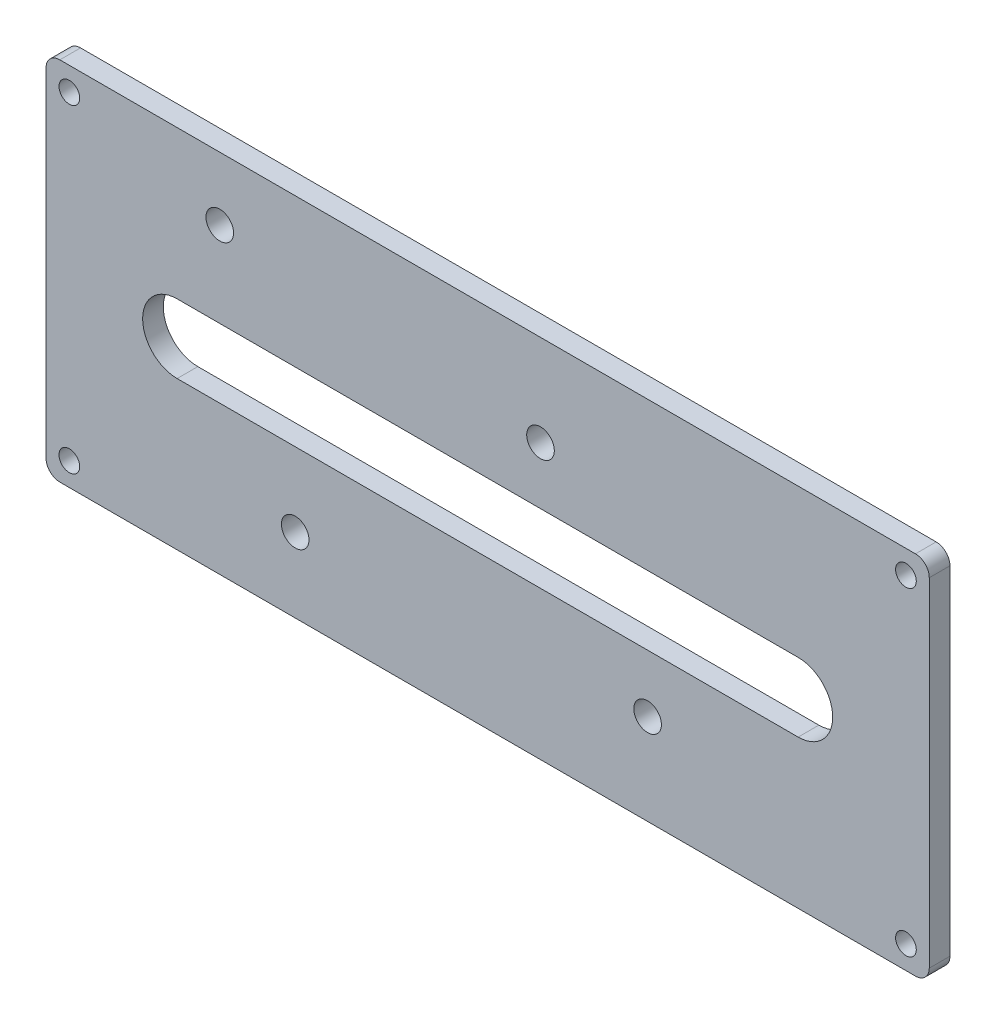
ISO-10303-21;
HEADER;
FILE_DESCRIPTION(('STEP AP214'),'2;1');
FILE_NAME('part.step','',(''),(''),'','','');
FILE_SCHEMA(('AUTOMOTIVE_DESIGN { 1 0 10303 214 1 1 1 1 }'));
ENDSEC;
DATA;
#1=APPLICATION_CONTEXT('core data for automotive mechanical design processes');
#2=APPLICATION_PROTOCOL_DEFINITION('international standard','automotive_design',2000,#1);
#3=PRODUCT_CONTEXT('',#1,'mechanical');
#4=PRODUCT('Part','Part','',(#3));
#5=PRODUCT_RELATED_PRODUCT_CATEGORY('part','',(#4));
#6=PRODUCT_DEFINITION_FORMATION('','',#4);
#7=PRODUCT_DEFINITION_CONTEXT('part definition',#1,'design');
#8=PRODUCT_DEFINITION('design','',#6,#7);
#9=PRODUCT_DEFINITION_SHAPE('','',#8);
#10=(LENGTH_UNIT() NAMED_UNIT(*) SI_UNIT(.MILLI.,.METRE.));
#11=(NAMED_UNIT(*) PLANE_ANGLE_UNIT() SI_UNIT($,.RADIAN.));
#12=(NAMED_UNIT(*) SI_UNIT($,.STERADIAN.) SOLID_ANGLE_UNIT());
#13=UNCERTAINTY_MEASURE_WITH_UNIT(LENGTH_MEASURE(1.E-05),#10,'distance_accuracy_value','');
#14=(GEOMETRIC_REPRESENTATION_CONTEXT(3) GLOBAL_UNCERTAINTY_ASSIGNED_CONTEXT((#13)) GLOBAL_UNIT_ASSIGNED_CONTEXT((#10,
#11,#12)) REPRESENTATION_CONTEXT('',''));
#15=CARTESIAN_POINT('',(0.,0.,0.));
#16=DIRECTION('',(0.,0.,1.));
#17=DIRECTION('',(1.,0.,0.));
#18=AXIS2_PLACEMENT_3D('',#15,#16,#17);
#19=CARTESIAN_POINT('',(-64.,26.5,3.));
#20=DIRECTION('',(1.,0.,0.));
#21=DIRECTION('',(0.,0.,-1.));
#22=AXIS2_PLACEMENT_3D('',#19,#20,#21);
#23=PLANE('',#22);
#24=DIRECTION('',(0.,-1.,0.));
#25=VECTOR('',#24,1.);
#26=CARTESIAN_POINT('',(-64.,26.5,0.));
#27=LINE('',#26,#25);
#28=CARTESIAN_POINT('',(-64.,24.5,0.));
#29=VERTEX_POINT('',#28);
#30=CARTESIAN_POINT('',(-64.,-24.5,0.));
#31=VERTEX_POINT('',#30);
#32=EDGE_CURVE('E192',#29,#31,#27,.T.);
#33=ORIENTED_EDGE('',*,*,#32,.T.);
#34=DIRECTION('',(0.,0.,-1.));
#35=VECTOR('',#34,1.);
#36=CARTESIAN_POINT('',(-64.,-24.5,3.));
#37=LINE('',#36,#35);
#38=CARTESIAN_POINT('',(-64.,-24.5,3.));
#39=VERTEX_POINT('',#38);
#40=EDGE_CURVE('E243',#31,#39,#37,.F.);
#41=ORIENTED_EDGE('',*,*,#40,.T.);
#42=DIRECTION('',(0.,-1.,0.));
#43=VECTOR('',#42,1.);
#44=CARTESIAN_POINT('',(-64.,26.5,3.));
#45=LINE('',#44,#43);
#46=CARTESIAN_POINT('',(-64.,24.5,3.));
#47=VERTEX_POINT('',#46);
#48=EDGE_CURVE('E195',#47,#39,#45,.T.);
#49=ORIENTED_EDGE('',*,*,#48,.F.);
#50=DIRECTION('',(0.,0.,-1.));
#51=VECTOR('',#50,1.);
#52=CARTESIAN_POINT('',(-64.,24.5,3.));
#53=LINE('',#52,#51);
#54=EDGE_CURVE('E240',#47,#29,#53,.T.);
#55=ORIENTED_EDGE('',*,*,#54,.T.);
#56=EDGE_LOOP('',(#33,#41,#49,#55));
#57=FACE_BOUND('',#56,.T.);
#58=ADVANCED_FACE('F33',(#57),#23,.F.);
#59=CARTESIAN_POINT('',(-64.,-26.5,3.));
#60=DIRECTION('',(0.,1.,0.));
#61=DIRECTION('',(0.,0.,1.));
#62=AXIS2_PLACEMENT_3D('',#59,#60,#61);
#63=PLANE('',#62);
#64=DIRECTION('',(1.,0.,0.));
#65=VECTOR('',#64,1.);
#66=CARTESIAN_POINT('',(-64.,-26.5,0.));
#67=LINE('',#66,#65);
#68=CARTESIAN_POINT('',(-62.,-26.5,0.));
#69=VERTEX_POINT('',#68);
#70=CARTESIAN_POINT('',(62.,-26.5,0.));
#71=VERTEX_POINT('',#70);
#72=EDGE_CURVE('E209',#69,#71,#67,.T.);
#73=ORIENTED_EDGE('',*,*,#72,.T.);
#74=DIRECTION('',(0.,0.,-1.));
#75=VECTOR('',#74,1.);
#76=CARTESIAN_POINT('',(62.,-26.5,3.));
#77=LINE('',#76,#75);
#78=CARTESIAN_POINT('',(62.,-26.5,3.));
#79=VERTEX_POINT('',#78);
#80=EDGE_CURVE('E231',#71,#79,#77,.F.);
#81=ORIENTED_EDGE('',*,*,#80,.T.);
#82=DIRECTION('',(1.,0.,0.));
#83=VECTOR('',#82,1.);
#84=CARTESIAN_POINT('',(-64.,-26.5,3.));
#85=LINE('',#84,#83);
#86=CARTESIAN_POINT('',(-62.,-26.5,3.));
#87=VERTEX_POINT('',#86);
#88=EDGE_CURVE('E198',#87,#79,#85,.T.);
#89=ORIENTED_EDGE('',*,*,#88,.F.);
#90=DIRECTION('',(0.,0.,-1.));
#91=VECTOR('',#90,1.);
#92=CARTESIAN_POINT('',(-62.,-26.5,3.));
#93=LINE('',#92,#91);
#94=EDGE_CURVE('E228',#87,#69,#93,.T.);
#95=ORIENTED_EDGE('',*,*,#94,.T.);
#96=EDGE_LOOP('',(#73,#81,#89,#95));
#97=FACE_BOUND('',#96,.T.);
#98=ADVANCED_FACE('F258',(#97),#63,.F.);
#99=CARTESIAN_POINT('',(64.,26.5,3.));
#100=DIRECTION('',(-1.,0.,0.));
#101=DIRECTION('',(0.,-1.,0.));
#102=AXIS2_PLACEMENT_3D('',#99,#100,#101);
#103=PLANE('',#102);
#104=DIRECTION('',(0.,1.,0.));
#105=VECTOR('',#104,1.);
#106=CARTESIAN_POINT('',(64.,26.5,3.));
#107=LINE('',#106,#105);
#108=CARTESIAN_POINT('',(64.,-24.5,3.));
#109=VERTEX_POINT('',#108);
#110=CARTESIAN_POINT('',(64.,24.5,3.));
#111=VERTEX_POINT('',#110);
#112=EDGE_CURVE('E202',#109,#111,#107,.T.);
#113=ORIENTED_EDGE('',*,*,#112,.F.);
#114=DIRECTION('',(0.,0.,-1.));
#115=VECTOR('',#114,1.);
#116=CARTESIAN_POINT('',(64.,-24.5,3.));
#117=LINE('',#116,#115);
#118=CARTESIAN_POINT('',(64.,-24.5,0.));
#119=VERTEX_POINT('',#118);
#120=EDGE_CURVE('E217',#109,#119,#117,.T.);
#121=ORIENTED_EDGE('',*,*,#120,.T.);
#122=DIRECTION('',(0.,1.,0.));
#123=VECTOR('',#122,1.);
#124=CARTESIAN_POINT('',(64.,26.5,0.));
#125=LINE('',#124,#123);
#126=CARTESIAN_POINT('',(64.,24.5,0.));
#127=VERTEX_POINT('',#126);
#128=EDGE_CURVE('E212',#119,#127,#125,.T.);
#129=ORIENTED_EDGE('',*,*,#128,.T.);
#130=DIRECTION('',(0.,0.,-1.));
#131=VECTOR('',#130,1.);
#132=CARTESIAN_POINT('',(64.,24.5,3.));
#133=LINE('',#132,#131);
#134=EDGE_CURVE('E206',#127,#111,#133,.F.);
#135=ORIENTED_EDGE('',*,*,#134,.T.);
#136=EDGE_LOOP('',(#113,#121,#129,#135));
#137=FACE_BOUND('',#136,.T.);
#138=ADVANCED_FACE('F268',(#137),#103,.F.);
#139=CARTESIAN_POINT('',(-64.,26.5,3.));
#140=DIRECTION('',(0.,-1.,0.));
#141=DIRECTION('',(1.,0.,0.));
#142=AXIS2_PLACEMENT_3D('',#139,#140,#141);
#143=PLANE('',#142);
#144=DIRECTION('',(-1.,0.,0.));
#145=VECTOR('',#144,1.);
#146=CARTESIAN_POINT('',(-64.,26.5,3.));
#147=LINE('',#146,#145);
#148=CARTESIAN_POINT('',(62.,26.5,3.));
#149=VERTEX_POINT('',#148);
#150=CARTESIAN_POINT('',(-62.,26.5,3.));
#151=VERTEX_POINT('',#150);
#152=EDGE_CURVE('E204',#149,#151,#147,.T.);
#153=ORIENTED_EDGE('',*,*,#152,.F.);
#154=DIRECTION('',(0.,0.,-1.));
#155=VECTOR('',#154,1.);
#156=CARTESIAN_POINT('',(62.,26.5,3.));
#157=LINE('',#156,#155);
#158=CARTESIAN_POINT('',(62.,26.5,0.));
#159=VERTEX_POINT('',#158);
#160=EDGE_CURVE('E11',#149,#159,#157,.T.);
#161=ORIENTED_EDGE('',*,*,#160,.T.);
#162=DIRECTION('',(-1.,0.,0.));
#163=VECTOR('',#162,1.);
#164=CARTESIAN_POINT('',(-64.,26.5,0.));
#165=LINE('',#164,#163);
#166=CARTESIAN_POINT('',(-62.,26.5,0.));
#167=VERTEX_POINT('',#166);
#168=EDGE_CURVE('E199',#159,#167,#165,.T.);
#169=ORIENTED_EDGE('',*,*,#168,.T.);
#170=DIRECTION('',(0.,0.,-1.));
#171=VECTOR('',#170,1.);
#172=CARTESIAN_POINT('',(-62.,26.5,3.));
#173=LINE('',#172,#171);
#174=EDGE_CURVE('E41',#167,#151,#173,.F.);
#175=ORIENTED_EDGE('',*,*,#174,.T.);
#176=EDGE_LOOP('',(#153,#161,#169,#175));
#177=FACE_BOUND('',#176,.T.);
#178=ADVANCED_FACE('F274',(#177),#143,.F.);
#179=CARTESIAN_POINT('',(0.,0.,3.));
#180=DIRECTION('',(0.,0.,1.));
#181=DIRECTION('',(1.,0.,0.));
#182=AXIS2_PLACEMENT_3D('',#179,#180,#181);
#183=PLANE('',#182);
#184=CARTESIAN_POINT('',(60.62,-23.12,3.));
#185=DIRECTION('',(0.,0.,1.));
#186=DIRECTION('',(1.,0.,0.));
#187=AXIS2_PLACEMENT_3D('',#184,#185,#186);
#188=CIRCLE('',#187,1.5);
#189=CARTESIAN_POINT('',(62.12,-23.12,3.));
#190=VERTEX_POINT('',#189);
#191=EDGE_CURVE('E463',#190,#190,#188,.T.);
#192=ORIENTED_EDGE('',*,*,#191,.F.);
#193=EDGE_LOOP('',(#192));
#194=FACE_BOUND('',#193,.T.);
#195=CARTESIAN_POINT('',(-60.62,-23.12,3.));
#196=DIRECTION('',(0.,0.,1.));
#197=DIRECTION('',(1.,0.,0.));
#198=AXIS2_PLACEMENT_3D('',#195,#196,#197);
#199=CIRCLE('',#198,1.5);
#200=CARTESIAN_POINT('',(-59.12,-23.12,3.));
#201=VERTEX_POINT('',#200);
#202=EDGE_CURVE('E467',#201,#201,#199,.T.);
#203=ORIENTED_EDGE('',*,*,#202,.F.);
#204=EDGE_LOOP('',(#203));
#205=FACE_BOUND('',#204,.T.);
#206=CARTESIAN_POINT('',(60.62,23.12,3.));
#207=DIRECTION('',(0.,0.,1.));
#208=DIRECTION('',(1.,0.,0.));
#209=AXIS2_PLACEMENT_3D('',#206,#207,#208);
#210=CIRCLE('',#209,1.5);
#211=CARTESIAN_POINT('',(62.12,23.12,3.));
#212=VERTEX_POINT('',#211);
#213=EDGE_CURVE('E471',#212,#212,#210,.T.);
#214=ORIENTED_EDGE('',*,*,#213,.F.);
#215=EDGE_LOOP('',(#214));
#216=FACE_BOUND('',#215,.T.);
#217=CARTESIAN_POINT('',(-60.62,23.12,3.));
#218=DIRECTION('',(0.,0.,1.));
#219=DIRECTION('',(1.,0.,0.));
#220=AXIS2_PLACEMENT_3D('',#217,#218,#219);
#221=CIRCLE('',#220,1.5);
#222=CARTESIAN_POINT('',(-59.12,23.12,3.));
#223=VERTEX_POINT('',#222);
#224=EDGE_CURVE('E154',#223,#223,#221,.T.);
#225=ORIENTED_EDGE('',*,*,#224,.F.);
#226=EDGE_LOOP('',(#225));
#227=FACE_BOUND('',#226,.T.);
#228=CARTESIAN_POINT('',(-44.9999996169632,0.,3.));
#229=DIRECTION('',(0.,0.,1.));
#230=DIRECTION('',(1.,0.,0.));
#231=AXIS2_PLACEMENT_3D('',#228,#229,#230);
#232=CIRCLE('',#231,5.00000000000003);
#233=CARTESIAN_POINT('',(-45.0000003830368,5.,3.));
#234=VERTEX_POINT('',#233);
#235=CARTESIAN_POINT('',(-44.9999996169632,-5.,3.));
#236=VERTEX_POINT('',#235);
#237=EDGE_CURVE('E130',#234,#236,#232,.T.);
#238=ORIENTED_EDGE('',*,*,#237,.F.);
#239=DIRECTION('',(-1.,0.,0.));
#240=VECTOR('',#239,1.);
#241=CARTESIAN_POINT('',(-45.0000003830368,5.,3.));
#242=LINE('',#241,#240);
#243=CARTESIAN_POINT('',(45.0000003830368,5.,3.));
#244=VERTEX_POINT('',#243);
#245=EDGE_CURVE('E148',#244,#234,#242,.T.);
#246=ORIENTED_EDGE('',*,*,#245,.F.);
#247=CARTESIAN_POINT('',(45.0000003830368,0.,3.));
#248=DIRECTION('',(0.,0.,1.));
#249=DIRECTION('',(-1.,0.,0.));
#250=AXIS2_PLACEMENT_3D('',#247,#248,#249);
#251=CIRCLE('',#250,5.);
#252=CARTESIAN_POINT('',(45.0000003830368,-5.,3.));
#253=VERTEX_POINT('',#252);
#254=EDGE_CURVE('E151',#253,#244,#251,.T.);
#255=ORIENTED_EDGE('',*,*,#254,.F.);
#256=DIRECTION('',(1.,0.,0.));
#257=VECTOR('',#256,1.);
#258=CARTESIAN_POINT('',(-44.9999996169632,-5.,3.));
#259=LINE('',#258,#257);
#260=EDGE_CURVE('E160',#236,#253,#259,.T.);
#261=ORIENTED_EDGE('',*,*,#260,.F.);
#262=EDGE_LOOP('',(#238,#246,#255,#261));
#263=FACE_BOUND('',#262,.T.);
#264=CARTESIAN_POINT('',(23.18,-13.35,3.));
#265=DIRECTION('',(0.,0.,1.));
#266=DIRECTION('',(1.,0.,0.));
#267=AXIS2_PLACEMENT_3D('',#264,#265,#266);
#268=CIRCLE('',#267,2.);
#269=CARTESIAN_POINT('',(25.18,-13.35,3.));
#270=VERTEX_POINT('',#269);
#271=EDGE_CURVE('E167',#270,#270,#268,.T.);
#272=ORIENTED_EDGE('',*,*,#271,.F.);
#273=EDGE_LOOP('',(#272));
#274=FACE_BOUND('',#273,.T.);
#275=CARTESIAN_POINT('',(-27.89,-15.71,3.));
#276=DIRECTION('',(0.,0.,1.));
#277=DIRECTION('',(1.,0.,0.));
#278=AXIS2_PLACEMENT_3D('',#275,#276,#277);
#279=CIRCLE('',#278,2.);
#280=CARTESIAN_POINT('',(-25.89,-15.71,3.));
#281=VERTEX_POINT('',#280);
#282=EDGE_CURVE('E174',#281,#281,#279,.T.);
#283=ORIENTED_EDGE('',*,*,#282,.F.);
#284=EDGE_LOOP('',(#283));
#285=FACE_BOUND('',#284,.T.);
#286=CARTESIAN_POINT('',(7.65999999999998,13.27,3.));
#287=DIRECTION('',(0.,0.,1.));
#288=DIRECTION('',(1.,0.,0.));
#289=AXIS2_PLACEMENT_3D('',#286,#287,#288);
#290=CIRCLE('',#289,2.);
#291=CARTESIAN_POINT('',(9.65999999999998,13.27,3.));
#292=VERTEX_POINT('',#291);
#293=EDGE_CURVE('E180',#292,#292,#290,.T.);
#294=ORIENTED_EDGE('',*,*,#293,.F.);
#295=EDGE_LOOP('',(#294));
#296=FACE_BOUND('',#295,.T.);
#297=CARTESIAN_POINT('',(-38.82,17.35,3.));
#298=DIRECTION('',(0.,0.,1.));
#299=DIRECTION('',(1.,0.,0.));
#300=AXIS2_PLACEMENT_3D('',#297,#298,#299);
#301=CIRCLE('',#300,2.);
#302=CARTESIAN_POINT('',(-36.82,17.35,3.));
#303=VERTEX_POINT('',#302);
#304=EDGE_CURVE('E186',#303,#303,#301,.T.);
#305=ORIENTED_EDGE('',*,*,#304,.F.);
#306=EDGE_LOOP('',(#305));
#307=FACE_BOUND('',#306,.T.);
#308=ORIENTED_EDGE('',*,*,#88,.T.);
#309=CARTESIAN_POINT('',(62.,-24.5,3.));
#310=DIRECTION('',(0.,0.,1.));
#311=DIRECTION('',(1.,0.,0.));
#312=AXIS2_PLACEMENT_3D('',#309,#310,#311);
#313=CIRCLE('',#312,2.);
#314=EDGE_CURVE('E238',#79,#109,#313,.T.);
#315=ORIENTED_EDGE('',*,*,#314,.T.);
#316=ORIENTED_EDGE('',*,*,#112,.T.);
#317=CARTESIAN_POINT('',(62.,24.5,3.));
#318=DIRECTION('',(0.,0.,1.));
#319=DIRECTION('',(1.,0.,0.));
#320=AXIS2_PLACEMENT_3D('',#317,#318,#319);
#321=CIRCLE('',#320,2.);
#322=EDGE_CURVE('E54',#111,#149,#321,.T.);
#323=ORIENTED_EDGE('',*,*,#322,.T.);
#324=ORIENTED_EDGE('',*,*,#152,.T.);
#325=CARTESIAN_POINT('',(-62.,24.5,3.));
#326=DIRECTION('',(0.,0.,1.));
#327=DIRECTION('',(1.,0.,0.));
#328=AXIS2_PLACEMENT_3D('',#325,#326,#327);
#329=CIRCLE('',#328,2.);
#330=EDGE_CURVE('E233',#151,#47,#329,.T.);
#331=ORIENTED_EDGE('',*,*,#330,.T.);
#332=ORIENTED_EDGE('',*,*,#48,.T.);
#333=CARTESIAN_POINT('',(-62.,-24.5,3.));
#334=DIRECTION('',(0.,0.,1.));
#335=DIRECTION('',(1.,0.,0.));
#336=AXIS2_PLACEMENT_3D('',#333,#334,#335);
#337=CIRCLE('',#336,2.);
#338=EDGE_CURVE('E236',#39,#87,#337,.T.);
#339=ORIENTED_EDGE('',*,*,#338,.T.);
#340=EDGE_LOOP('',(#308,#315,#316,#323,#324,#331,#332,#339));
#341=FACE_BOUND('',#340,.T.);
#342=ADVANCED_FACE('F251',(#194,#205,#216,#227,#263,#274,#285,#296,#307,#341),#183,.T.);
#343=CARTESIAN_POINT('',(0.,0.,0.));
#344=DIRECTION('',(0.,0.,1.));
#345=DIRECTION('',(1.,0.,0.));
#346=AXIS2_PLACEMENT_3D('',#343,#344,#345);
#347=PLANE('',#346);
#348=CARTESIAN_POINT('',(60.62,-23.12,0.));
#349=DIRECTION('',(0.,0.,1.));
#350=DIRECTION('',(1.,0.,0.));
#351=AXIS2_PLACEMENT_3D('',#348,#349,#350);
#352=CIRCLE('',#351,1.5);
#353=CARTESIAN_POINT('',(62.12,-23.12,0.));
#354=VERTEX_POINT('',#353);
#355=EDGE_CURVE('E500',#354,#354,#352,.T.);
#356=ORIENTED_EDGE('',*,*,#355,.T.);
#357=EDGE_LOOP('',(#356));
#358=FACE_BOUND('',#357,.T.);
#359=CARTESIAN_POINT('',(-60.62,-23.12,0.));
#360=DIRECTION('',(0.,0.,1.));
#361=DIRECTION('',(1.,0.,0.));
#362=AXIS2_PLACEMENT_3D('',#359,#360,#361);
#363=CIRCLE('',#362,1.5);
#364=CARTESIAN_POINT('',(-59.12,-23.12,0.));
#365=VERTEX_POINT('',#364);
#366=EDGE_CURVE('E496',#365,#365,#363,.T.);
#367=ORIENTED_EDGE('',*,*,#366,.T.);
#368=EDGE_LOOP('',(#367));
#369=FACE_BOUND('',#368,.T.);
#370=CARTESIAN_POINT('',(60.62,23.12,0.));
#371=DIRECTION('',(0.,0.,1.));
#372=DIRECTION('',(1.,0.,0.));
#373=AXIS2_PLACEMENT_3D('',#370,#371,#372);
#374=CIRCLE('',#373,1.5);
#375=CARTESIAN_POINT('',(62.12,23.12,0.));
#376=VERTEX_POINT('',#375);
#377=EDGE_CURVE('E490',#376,#376,#374,.T.);
#378=ORIENTED_EDGE('',*,*,#377,.T.);
#379=EDGE_LOOP('',(#378));
#380=FACE_BOUND('',#379,.T.);
#381=CARTESIAN_POINT('',(-60.62,23.12,0.));
#382=DIRECTION('',(0.,0.,1.));
#383=DIRECTION('',(1.,0.,0.));
#384=AXIS2_PLACEMENT_3D('',#381,#382,#383);
#385=CIRCLE('',#384,1.5);
#386=CARTESIAN_POINT('',(-59.12,23.12,0.));
#387=VERTEX_POINT('',#386);
#388=EDGE_CURVE('E161',#387,#387,#385,.T.);
#389=ORIENTED_EDGE('',*,*,#388,.T.);
#390=EDGE_LOOP('',(#389));
#391=FACE_BOUND('',#390,.T.);
#392=DIRECTION('',(-1.,0.,0.));
#393=VECTOR('',#392,1.);
#394=CARTESIAN_POINT('',(-45.0000003830368,5.,0.));
#395=LINE('',#394,#393);
#396=CARTESIAN_POINT('',(45.0000003830368,5.,0.));
#397=VERTEX_POINT('',#396);
#398=CARTESIAN_POINT('',(-45.0000003830368,5.,0.));
#399=VERTEX_POINT('',#398);
#400=EDGE_CURVE('E135',#397,#399,#395,.T.);
#401=ORIENTED_EDGE('',*,*,#400,.T.);
#402=CARTESIAN_POINT('',(-44.9999996169632,0.,0.));
#403=DIRECTION('',(0.,0.,1.));
#404=DIRECTION('',(1.,0.,0.));
#405=AXIS2_PLACEMENT_3D('',#402,#403,#404);
#406=CIRCLE('',#405,5.00000000000003);
#407=CARTESIAN_POINT('',(-44.9999996169632,-5.,0.));
#408=VERTEX_POINT('',#407);
#409=EDGE_CURVE('E127',#399,#408,#406,.T.);
#410=ORIENTED_EDGE('',*,*,#409,.T.);
#411=DIRECTION('',(1.,0.,0.));
#412=VECTOR('',#411,1.);
#413=CARTESIAN_POINT('',(-44.9999996169632,-5.,0.));
#414=LINE('',#413,#412);
#415=CARTESIAN_POINT('',(45.0000003830368,-5.,0.));
#416=VERTEX_POINT('',#415);
#417=EDGE_CURVE('E139',#408,#416,#414,.T.);
#418=ORIENTED_EDGE('',*,*,#417,.T.);
#419=CARTESIAN_POINT('',(45.0000003830368,0.,0.));
#420=DIRECTION('',(0.,0.,1.));
#421=DIRECTION('',(-1.,0.,0.));
#422=AXIS2_PLACEMENT_3D('',#419,#420,#421);
#423=CIRCLE('',#422,5.);
#424=EDGE_CURVE('E143',#416,#397,#423,.T.);
#425=ORIENTED_EDGE('',*,*,#424,.T.);
#426=EDGE_LOOP('',(#401,#410,#418,#425));
#427=FACE_BOUND('',#426,.T.);
#428=CARTESIAN_POINT('',(23.18,-13.35,0.));
#429=DIRECTION('',(0.,0.,1.));
#430=DIRECTION('',(1.,0.,0.));
#431=AXIS2_PLACEMENT_3D('',#428,#429,#430);
#432=CIRCLE('',#431,2.);
#433=CARTESIAN_POINT('',(25.18,-13.35,0.));
#434=VERTEX_POINT('',#433);
#435=EDGE_CURVE('E171',#434,#434,#432,.T.);
#436=ORIENTED_EDGE('',*,*,#435,.T.);
#437=EDGE_LOOP('',(#436));
#438=FACE_BOUND('',#437,.T.);
#439=CARTESIAN_POINT('',(-27.89,-15.71,0.));
#440=DIRECTION('',(0.,0.,1.));
#441=DIRECTION('',(1.,0.,0.));
#442=AXIS2_PLACEMENT_3D('',#439,#440,#441);
#443=CIRCLE('',#442,2.);
#444=CARTESIAN_POINT('',(-25.89,-15.71,0.));
#445=VERTEX_POINT('',#444);
#446=EDGE_CURVE('E177',#445,#445,#443,.T.);
#447=ORIENTED_EDGE('',*,*,#446,.T.);
#448=EDGE_LOOP('',(#447));
#449=FACE_BOUND('',#448,.T.);
#450=CARTESIAN_POINT('',(7.65999999999998,13.27,0.));
#451=DIRECTION('',(0.,0.,1.));
#452=DIRECTION('',(1.,0.,0.));
#453=AXIS2_PLACEMENT_3D('',#450,#451,#452);
#454=CIRCLE('',#453,2.);
#455=CARTESIAN_POINT('',(9.65999999999998,13.27,0.));
#456=VERTEX_POINT('',#455);
#457=EDGE_CURVE('E183',#456,#456,#454,.T.);
#458=ORIENTED_EDGE('',*,*,#457,.T.);
#459=EDGE_LOOP('',(#458));
#460=FACE_BOUND('',#459,.T.);
#461=CARTESIAN_POINT('',(-38.82,17.35,0.));
#462=DIRECTION('',(0.,0.,1.));
#463=DIRECTION('',(1.,0.,0.));
#464=AXIS2_PLACEMENT_3D('',#461,#462,#463);
#465=CIRCLE('',#464,2.);
#466=CARTESIAN_POINT('',(-36.82,17.35,0.));
#467=VERTEX_POINT('',#466);
#468=EDGE_CURVE('E189',#467,#467,#465,.T.);
#469=ORIENTED_EDGE('',*,*,#468,.T.);
#470=EDGE_LOOP('',(#469));
#471=FACE_BOUND('',#470,.T.);
#472=ORIENTED_EDGE('',*,*,#128,.F.);
#473=CARTESIAN_POINT('',(62.,-24.5,0.));
#474=DIRECTION('',(0.,0.,1.));
#475=DIRECTION('',(1.,0.,0.));
#476=AXIS2_PLACEMENT_3D('',#473,#474,#475);
#477=CIRCLE('',#476,2.);
#478=EDGE_CURVE('E226',#119,#71,#477,.F.);
#479=ORIENTED_EDGE('',*,*,#478,.T.);
#480=ORIENTED_EDGE('',*,*,#72,.F.);
#481=CARTESIAN_POINT('',(-62.,-24.5,0.));
#482=DIRECTION('',(0.,0.,1.));
#483=DIRECTION('',(1.,0.,0.));
#484=AXIS2_PLACEMENT_3D('',#481,#482,#483);
#485=CIRCLE('',#484,2.);
#486=EDGE_CURVE('E224',#69,#31,#485,.F.);
#487=ORIENTED_EDGE('',*,*,#486,.T.);
#488=ORIENTED_EDGE('',*,*,#32,.F.);
#489=CARTESIAN_POINT('',(-62.,24.5,0.));
#490=DIRECTION('',(0.,0.,1.));
#491=DIRECTION('',(1.,0.,0.));
#492=AXIS2_PLACEMENT_3D('',#489,#490,#491);
#493=CIRCLE('',#492,2.);
#494=EDGE_CURVE('E220',#29,#167,#493,.F.);
#495=ORIENTED_EDGE('',*,*,#494,.T.);
#496=ORIENTED_EDGE('',*,*,#168,.F.);
#497=CARTESIAN_POINT('',(62.,24.5,0.));
#498=DIRECTION('',(0.,0.,1.));
#499=DIRECTION('',(1.,0.,0.));
#500=AXIS2_PLACEMENT_3D('',#497,#498,#499);
#501=CIRCLE('',#500,2.);
#502=EDGE_CURVE('E222',#159,#127,#501,.F.);
#503=ORIENTED_EDGE('',*,*,#502,.T.);
#504=EDGE_LOOP('',(#472,#479,#480,#487,#488,#495,#496,#503));
#505=FACE_BOUND('',#504,.T.);
#506=ADVANCED_FACE('F145',(#358,#369,#380,#391,#427,#438,#449,#460,#471,#505),#347,.F.);
#507=CARTESIAN_POINT('',(-38.82,17.35,0.));
#508=DIRECTION('',(0.,0.,1.));
#509=DIRECTION('',(1.,0.,0.));
#510=AXIS2_PLACEMENT_3D('',#507,#508,#509);
#511=CYLINDRICAL_SURFACE('',#510,2.);
#512=ORIENTED_EDGE('',*,*,#468,.F.);
#513=EDGE_LOOP('',(#512));
#514=FACE_BOUND('',#513,.T.);
#515=ORIENTED_EDGE('',*,*,#304,.T.);
#516=EDGE_LOOP('',(#515));
#517=FACE_BOUND('',#516,.T.);
#518=ADVANCED_FACE('F407',(#514,#517),#511,.F.);
#519=CARTESIAN_POINT('',(7.65999999999998,13.27,0.));
#520=DIRECTION('',(0.,0.,1.));
#521=DIRECTION('',(1.,0.,0.));
#522=AXIS2_PLACEMENT_3D('',#519,#520,#521);
#523=CYLINDRICAL_SURFACE('',#522,2.);
#524=ORIENTED_EDGE('',*,*,#457,.F.);
#525=EDGE_LOOP('',(#524));
#526=FACE_BOUND('',#525,.T.);
#527=ORIENTED_EDGE('',*,*,#293,.T.);
#528=EDGE_LOOP('',(#527));
#529=FACE_BOUND('',#528,.T.);
#530=ADVANCED_FACE('F398',(#526,#529),#523,.F.);
#531=CARTESIAN_POINT('',(-27.89,-15.71,0.));
#532=DIRECTION('',(0.,0.,1.));
#533=DIRECTION('',(1.,0.,0.));
#534=AXIS2_PLACEMENT_3D('',#531,#532,#533);
#535=CYLINDRICAL_SURFACE('',#534,2.);
#536=ORIENTED_EDGE('',*,*,#446,.F.);
#537=EDGE_LOOP('',(#536));
#538=FACE_BOUND('',#537,.T.);
#539=ORIENTED_EDGE('',*,*,#282,.T.);
#540=EDGE_LOOP('',(#539));
#541=FACE_BOUND('',#540,.T.);
#542=ADVANCED_FACE('F389',(#538,#541),#535,.F.);
#543=CARTESIAN_POINT('',(23.18,-13.35,0.));
#544=DIRECTION('',(0.,0.,1.));
#545=DIRECTION('',(1.,0.,0.));
#546=AXIS2_PLACEMENT_3D('',#543,#544,#545);
#547=CYLINDRICAL_SURFACE('',#546,2.);
#548=ORIENTED_EDGE('',*,*,#435,.F.);
#549=EDGE_LOOP('',(#548));
#550=FACE_BOUND('',#549,.T.);
#551=ORIENTED_EDGE('',*,*,#271,.T.);
#552=EDGE_LOOP('',(#551));
#553=FACE_BOUND('',#552,.T.);
#554=ADVANCED_FACE('F381',(#550,#553),#547,.F.);
#555=CARTESIAN_POINT('',(-44.9999996169632,0.,0.));
#556=DIRECTION('',(0.,0.,1.));
#557=DIRECTION('',(1.,0.,0.));
#558=AXIS2_PLACEMENT_3D('',#555,#556,#557);
#559=CYLINDRICAL_SURFACE('',#558,5.00000000000003);
#560=ORIENTED_EDGE('',*,*,#237,.T.);
#561=DIRECTION('',(0.,0.,1.));
#562=VECTOR('',#561,1.);
#563=CARTESIAN_POINT('',(-44.9999996169632,-5.,0.));
#564=LINE('',#563,#562);
#565=EDGE_CURVE('E123',#408,#236,#564,.T.);
#566=ORIENTED_EDGE('',*,*,#565,.F.);
#567=ORIENTED_EDGE('',*,*,#409,.F.);
#568=DIRECTION('',(0.,0.,1.));
#569=VECTOR('',#568,1.);
#570=CARTESIAN_POINT('',(-45.0000003830368,5.,0.));
#571=LINE('',#570,#569);
#572=EDGE_CURVE('E165',#399,#234,#571,.T.);
#573=ORIENTED_EDGE('',*,*,#572,.T.);
#574=EDGE_LOOP('',(#560,#566,#567,#573));
#575=FACE_BOUND('',#574,.T.);
#576=ADVANCED_FACE('F125',(#575),#559,.F.);
#577=CARTESIAN_POINT('',(-45.0000003830368,5.,0.));
#578=DIRECTION('',(0.,1.,0.));
#579=DIRECTION('',(-1.,0.,0.));
#580=AXIS2_PLACEMENT_3D('',#577,#578,#579);
#581=PLANE('',#580);
#582=ORIENTED_EDGE('',*,*,#245,.T.);
#583=ORIENTED_EDGE('',*,*,#572,.F.);
#584=ORIENTED_EDGE('',*,*,#400,.F.);
#585=DIRECTION('',(0.,0.,1.));
#586=VECTOR('',#585,1.);
#587=CARTESIAN_POINT('',(45.0000003830368,5.,0.));
#588=LINE('',#587,#586);
#589=EDGE_CURVE('E168',#397,#244,#588,.T.);
#590=ORIENTED_EDGE('',*,*,#589,.T.);
#591=EDGE_LOOP('',(#582,#583,#584,#590));
#592=FACE_BOUND('',#591,.T.);
#593=ADVANCED_FACE('F364',(#592),#581,.F.);
#594=CARTESIAN_POINT('',(45.0000003830368,0.,0.));
#595=DIRECTION('',(0.,0.,1.));
#596=DIRECTION('',(1.,0.,0.));
#597=AXIS2_PLACEMENT_3D('',#594,#595,#596);
#598=CYLINDRICAL_SURFACE('',#597,5.);
#599=ORIENTED_EDGE('',*,*,#254,.T.);
#600=ORIENTED_EDGE('',*,*,#589,.F.);
#601=ORIENTED_EDGE('',*,*,#424,.F.);
#602=DIRECTION('',(0.,0.,1.));
#603=VECTOR('',#602,1.);
#604=CARTESIAN_POINT('',(45.0000003830368,-5.,0.));
#605=LINE('',#604,#603);
#606=EDGE_CURVE('E134',#416,#253,#605,.T.);
#607=ORIENTED_EDGE('',*,*,#606,.T.);
#608=EDGE_LOOP('',(#599,#600,#601,#607));
#609=FACE_BOUND('',#608,.T.);
#610=ADVANCED_FACE('F356',(#609),#598,.F.);
#611=CARTESIAN_POINT('',(-44.9999996169632,-5.,0.));
#612=DIRECTION('',(0.,-1.,0.));
#613=DIRECTION('',(0.,0.,-1.));
#614=AXIS2_PLACEMENT_3D('',#611,#612,#613);
#615=PLANE('',#614);
#616=ORIENTED_EDGE('',*,*,#260,.T.);
#617=ORIENTED_EDGE('',*,*,#606,.F.);
#618=ORIENTED_EDGE('',*,*,#417,.F.);
#619=ORIENTED_EDGE('',*,*,#565,.T.);
#620=EDGE_LOOP('',(#616,#617,#618,#619));
#621=FACE_BOUND('',#620,.T.);
#622=ADVANCED_FACE('F140',(#621),#615,.F.);
#623=CARTESIAN_POINT('',(-60.62,23.12,0.));
#624=DIRECTION('',(0.,0.,1.));
#625=DIRECTION('',(1.,0.,0.));
#626=AXIS2_PLACEMENT_3D('',#623,#624,#625);
#627=CYLINDRICAL_SURFACE('',#626,1.5);
#628=ORIENTED_EDGE('',*,*,#388,.F.);
#629=EDGE_LOOP('',(#628));
#630=FACE_BOUND('',#629,.T.);
#631=ORIENTED_EDGE('',*,*,#224,.T.);
#632=EDGE_LOOP('',(#631));
#633=FACE_BOUND('',#632,.T.);
#634=ADVANCED_FACE('F339',(#630,#633),#627,.F.);
#635=CARTESIAN_POINT('',(60.62,23.12,0.));
#636=DIRECTION('',(0.,0.,1.));
#637=DIRECTION('',(1.,0.,0.));
#638=AXIS2_PLACEMENT_3D('',#635,#636,#637);
#639=CYLINDRICAL_SURFACE('',#638,1.5);
#640=ORIENTED_EDGE('',*,*,#377,.F.);
#641=EDGE_LOOP('',(#640));
#642=FACE_BOUND('',#641,.T.);
#643=ORIENTED_EDGE('',*,*,#213,.T.);
#644=EDGE_LOOP('',(#643));
#645=FACE_BOUND('',#644,.T.);
#646=ADVANCED_FACE('F330',(#642,#645),#639,.F.);
#647=CARTESIAN_POINT('',(-60.62,-23.12,0.));
#648=DIRECTION('',(0.,0.,1.));
#649=DIRECTION('',(1.,0.,0.));
#650=AXIS2_PLACEMENT_3D('',#647,#648,#649);
#651=CYLINDRICAL_SURFACE('',#650,1.5);
#652=ORIENTED_EDGE('',*,*,#366,.F.);
#653=EDGE_LOOP('',(#652));
#654=FACE_BOUND('',#653,.T.);
#655=ORIENTED_EDGE('',*,*,#202,.T.);
#656=EDGE_LOOP('',(#655));
#657=FACE_BOUND('',#656,.T.);
#658=ADVANCED_FACE('F321',(#654,#657),#651,.F.);
#659=CARTESIAN_POINT('',(60.62,-23.12,0.));
#660=DIRECTION('',(0.,0.,1.));
#661=DIRECTION('',(1.,0.,0.));
#662=AXIS2_PLACEMENT_3D('',#659,#660,#661);
#663=CYLINDRICAL_SURFACE('',#662,1.5);
#664=ORIENTED_EDGE('',*,*,#355,.F.);
#665=EDGE_LOOP('',(#664));
#666=FACE_BOUND('',#665,.T.);
#667=ORIENTED_EDGE('',*,*,#191,.T.);
#668=EDGE_LOOP('',(#667));
#669=FACE_BOUND('',#668,.T.);
#670=ADVANCED_FACE('F291',(#666,#669),#663,.F.);
#671=CARTESIAN_POINT('',(62.,-24.5,3.));
#672=DIRECTION('',(0.,0.,-1.));
#673=DIRECTION('',(-1.,0.,0.));
#674=AXIS2_PLACEMENT_3D('',#671,#672,#673);
#675=CYLINDRICAL_SURFACE('',#674,2.);
#676=ORIENTED_EDGE('',*,*,#314,.F.);
#677=ORIENTED_EDGE('',*,*,#80,.F.);
#678=ORIENTED_EDGE('',*,*,#478,.F.);
#679=ORIENTED_EDGE('',*,*,#120,.F.);
#680=EDGE_LOOP('',(#676,#677,#678,#679));
#681=FACE_BOUND('',#680,.T.);
#682=ADVANCED_FACE('F265',(#681),#675,.T.);
#683=CARTESIAN_POINT('',(-62.,-24.5,3.));
#684=DIRECTION('',(0.,0.,-1.));
#685=DIRECTION('',(-1.,0.,0.));
#686=AXIS2_PLACEMENT_3D('',#683,#684,#685);
#687=CYLINDRICAL_SURFACE('',#686,2.);
#688=ORIENTED_EDGE('',*,*,#338,.F.);
#689=ORIENTED_EDGE('',*,*,#40,.F.);
#690=ORIENTED_EDGE('',*,*,#486,.F.);
#691=ORIENTED_EDGE('',*,*,#94,.F.);
#692=EDGE_LOOP('',(#688,#689,#690,#691));
#693=FACE_BOUND('',#692,.T.);
#694=ADVANCED_FACE('F255',(#693),#687,.T.);
#695=CARTESIAN_POINT('',(62.,24.5,3.));
#696=DIRECTION('',(0.,0.,-1.));
#697=DIRECTION('',(-1.,0.,0.));
#698=AXIS2_PLACEMENT_3D('',#695,#696,#697);
#699=CYLINDRICAL_SURFACE('',#698,2.);
#700=ORIENTED_EDGE('',*,*,#322,.F.);
#701=ORIENTED_EDGE('',*,*,#134,.F.);
#702=ORIENTED_EDGE('',*,*,#502,.F.);
#703=ORIENTED_EDGE('',*,*,#160,.F.);
#704=EDGE_LOOP('',(#700,#701,#702,#703));
#705=FACE_BOUND('',#704,.T.);
#706=ADVANCED_FACE('F272',(#705),#699,.T.);
#707=CARTESIAN_POINT('',(-62.,24.5,3.));
#708=DIRECTION('',(0.,0.,-1.));
#709=DIRECTION('',(-1.,0.,0.));
#710=AXIS2_PLACEMENT_3D('',#707,#708,#709);
#711=CYLINDRICAL_SURFACE('',#710,2.);
#712=ORIENTED_EDGE('',*,*,#330,.F.);
#713=ORIENTED_EDGE('',*,*,#174,.F.);
#714=ORIENTED_EDGE('',*,*,#494,.F.);
#715=ORIENTED_EDGE('',*,*,#54,.F.);
#716=EDGE_LOOP('',(#712,#713,#714,#715));
#717=FACE_BOUND('',#716,.T.);
#718=ADVANCED_FACE('F35',(#717),#711,.T.);
#719=CLOSED_SHELL('',(#58,#98,#138,#178,#342,#506,#518,#530,#542,#554,#576,#593,#610,#622,#634,
#646,#658,#670,#682,#694,#706,#718));
#720=MANIFOLD_SOLID_BREP('B2',#719);
#721=ADVANCED_BREP_SHAPE_REPRESENTATION('',(#18,#720),#14);
#722=SHAPE_DEFINITION_REPRESENTATION(#9,#721);
ENDSEC;
END-ISO-10303-21;
